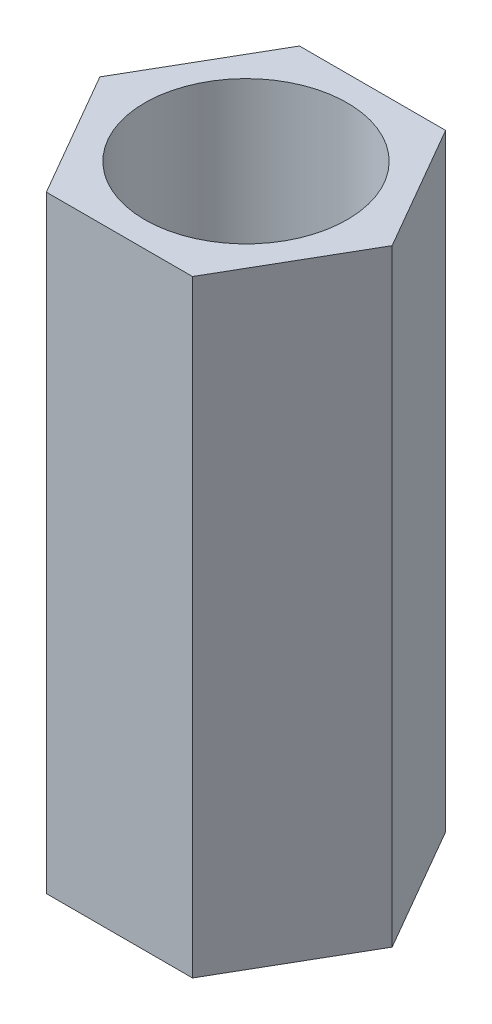
ISO-10303-21;
HEADER;
FILE_DESCRIPTION(('STEP AP214'),'2;1');
FILE_NAME('part.step','',(''),(''),'','','');
FILE_SCHEMA(('AUTOMOTIVE_DESIGN { 1 0 10303 214 1 1 1 1 }'));
ENDSEC;
DATA;
#1=APPLICATION_CONTEXT('core data for automotive mechanical design processes');
#2=APPLICATION_PROTOCOL_DEFINITION('international standard','automotive_design',2000,#1);
#3=PRODUCT_CONTEXT('',#1,'mechanical');
#4=PRODUCT('Part','Part','',(#3));
#5=PRODUCT_RELATED_PRODUCT_CATEGORY('part','',(#4));
#6=PRODUCT_DEFINITION_FORMATION('','',#4);
#7=PRODUCT_DEFINITION_CONTEXT('part definition',#1,'design');
#8=PRODUCT_DEFINITION('design','',#6,#7);
#9=PRODUCT_DEFINITION_SHAPE('','',#8);
#10=(LENGTH_UNIT() NAMED_UNIT(*) SI_UNIT(.MILLI.,.METRE.));
#11=(NAMED_UNIT(*) PLANE_ANGLE_UNIT() SI_UNIT($,.RADIAN.));
#12=(NAMED_UNIT(*) SI_UNIT($,.STERADIAN.) SOLID_ANGLE_UNIT());
#13=UNCERTAINTY_MEASURE_WITH_UNIT(LENGTH_MEASURE(1.E-05),#10,'distance_accuracy_value','');
#14=(GEOMETRIC_REPRESENTATION_CONTEXT(3) GLOBAL_UNCERTAINTY_ASSIGNED_CONTEXT((#13)) GLOBAL_UNIT_ASSIGNED_CONTEXT((#10,
#11,#12)) REPRESENTATION_CONTEXT('',''));
#15=CARTESIAN_POINT('',(0.,0.,0.));
#16=DIRECTION('',(0.,0.,1.));
#17=DIRECTION('',(1.,0.,0.));
#18=AXIS2_PLACEMENT_3D('',#15,#16,#17);
#19=CARTESIAN_POINT('',(0.,12.,0.));
#20=DIRECTION('',(0.,1.,0.));
#21=DIRECTION('',(0.,0.,1.));
#22=AXIS2_PLACEMENT_3D('',#19,#20,#21);
#23=PLANE('',#22);
#24=DIRECTION('',(-0.5,0.,-0.866025403784439));
#25=VECTOR('',#24,1.);
#26=CARTESIAN_POINT('',(2.88675134594813,12.,0.));
#27=LINE('',#26,#25);
#28=CARTESIAN_POINT('',(2.88675134594813,12.,0.));
#29=VERTEX_POINT('',#28);
#30=CARTESIAN_POINT('',(1.44337567297406,12.,-2.5));
#31=VERTEX_POINT('',#30);
#32=EDGE_CURVE('E130',#29,#31,#27,.T.);
#33=ORIENTED_EDGE('',*,*,#32,.T.);
#34=DIRECTION('',(-1.,0.,0.));
#35=VECTOR('',#34,1.);
#36=CARTESIAN_POINT('',(1.44337567297406,12.,-2.5));
#37=LINE('',#36,#35);
#38=CARTESIAN_POINT('',(-1.44337567297406,12.,-2.5));
#39=VERTEX_POINT('',#38);
#40=EDGE_CURVE('E88',#31,#39,#37,.T.);
#41=ORIENTED_EDGE('',*,*,#40,.T.);
#42=DIRECTION('',(-0.5,0.,0.866025403784439));
#43=VECTOR('',#42,1.);
#44=CARTESIAN_POINT('',(-1.44337567297406,12.,-2.5));
#45=LINE('',#44,#43);
#46=CARTESIAN_POINT('',(-2.88675134594813,12.,0.));
#47=VERTEX_POINT('',#46);
#48=EDGE_CURVE('E101',#39,#47,#45,.T.);
#49=ORIENTED_EDGE('',*,*,#48,.T.);
#50=DIRECTION('',(0.5,0.,0.866025403784439));
#51=VECTOR('',#50,1.);
#52=CARTESIAN_POINT('',(-2.88675134594813,12.,0.));
#53=LINE('',#52,#51);
#54=CARTESIAN_POINT('',(-1.44337567297406,12.,2.5));
#55=VERTEX_POINT('',#54);
#56=EDGE_CURVE('E95',#47,#55,#53,.T.);
#57=ORIENTED_EDGE('',*,*,#56,.T.);
#58=DIRECTION('',(1.,0.,0.));
#59=VECTOR('',#58,1.);
#60=CARTESIAN_POINT('',(-1.44337567297406,12.,2.5));
#61=LINE('',#60,#59);
#62=CARTESIAN_POINT('',(1.44337567297406,12.,2.5));
#63=VERTEX_POINT('',#62);
#64=EDGE_CURVE('E99',#55,#63,#61,.T.);
#65=ORIENTED_EDGE('',*,*,#64,.T.);
#66=DIRECTION('',(0.5,0.,-0.866025403784438));
#67=VECTOR('',#66,1.);
#68=CARTESIAN_POINT('',(1.44337567297406,12.,2.5));
#69=LINE('',#68,#67);
#70=EDGE_CURVE('E51',#63,#29,#69,.T.);
#71=ORIENTED_EDGE('',*,*,#70,.T.);
#72=EDGE_LOOP('',(#33,#41,#49,#57,#65,#71));
#73=FACE_BOUND('',#72,.T.);
#74=CARTESIAN_POINT('',(0.,12.,0.));
#75=DIRECTION('',(0.,1.,0.));
#76=DIRECTION('',(0.,0.,1.));
#77=AXIS2_PLACEMENT_3D('',#74,#75,#76);
#78=CIRCLE('',#77,2.);
#79=CARTESIAN_POINT('',(0.,12.,2.));
#80=VERTEX_POINT('',#79);
#81=EDGE_CURVE('E123',#80,#80,#78,.T.);
#82=ORIENTED_EDGE('',*,*,#81,.F.);
#83=EDGE_LOOP('',(#82));
#84=FACE_BOUND('',#83,.T.);
#85=ADVANCED_FACE('F34',(#73,#84),#23,.T.);
#86=CARTESIAN_POINT('',(0.,0.,0.));
#87=DIRECTION('',(0.,1.,0.));
#88=DIRECTION('',(0.,0.,1.));
#89=AXIS2_PLACEMENT_3D('',#86,#87,#88);
#90=PLANE('',#89);
#91=DIRECTION('',(-0.5,0.,-0.866025403784439));
#92=VECTOR('',#91,1.);
#93=CARTESIAN_POINT('',(2.88675134594813,0.,0.));
#94=LINE('',#93,#92);
#95=CARTESIAN_POINT('',(2.88675134594813,0.,0.));
#96=VERTEX_POINT('',#95);
#97=CARTESIAN_POINT('',(1.44337567297406,0.,-2.5));
#98=VERTEX_POINT('',#97);
#99=EDGE_CURVE('E119',#96,#98,#94,.T.);
#100=ORIENTED_EDGE('',*,*,#99,.F.);
#101=DIRECTION('',(0.5,0.,-0.866025403784438));
#102=VECTOR('',#101,1.);
#103=CARTESIAN_POINT('',(1.44337567297406,0.,2.5));
#104=LINE('',#103,#102);
#105=CARTESIAN_POINT('',(1.44337567297406,0.,2.5));
#106=VERTEX_POINT('',#105);
#107=EDGE_CURVE('E80',#106,#96,#104,.T.);
#108=ORIENTED_EDGE('',*,*,#107,.F.);
#109=DIRECTION('',(1.,0.,0.));
#110=VECTOR('',#109,1.);
#111=CARTESIAN_POINT('',(-1.44337567297406,0.,2.5));
#112=LINE('',#111,#110);
#113=CARTESIAN_POINT('',(-1.44337567297406,0.,2.5));
#114=VERTEX_POINT('',#113);
#115=EDGE_CURVE('E74',#114,#106,#112,.T.);
#116=ORIENTED_EDGE('',*,*,#115,.F.);
#117=DIRECTION('',(0.5,0.,0.866025403784439));
#118=VECTOR('',#117,1.);
#119=CARTESIAN_POINT('',(-2.88675134594813,0.,0.));
#120=LINE('',#119,#118);
#121=CARTESIAN_POINT('',(-2.88675134594813,0.,0.));
#122=VERTEX_POINT('',#121);
#123=EDGE_CURVE('E109',#122,#114,#120,.T.);
#124=ORIENTED_EDGE('',*,*,#123,.F.);
#125=DIRECTION('',(-0.5,0.,0.866025403784439));
#126=VECTOR('',#125,1.);
#127=CARTESIAN_POINT('',(-1.44337567297406,0.,-2.5));
#128=LINE('',#127,#126);
#129=CARTESIAN_POINT('',(-1.44337567297406,0.,-2.5));
#130=VERTEX_POINT('',#129);
#131=EDGE_CURVE('E125',#130,#122,#128,.T.);
#132=ORIENTED_EDGE('',*,*,#131,.F.);
#133=DIRECTION('',(-1.,0.,0.));
#134=VECTOR('',#133,1.);
#135=CARTESIAN_POINT('',(1.44337567297406,0.,-2.5));
#136=LINE('',#135,#134);
#137=EDGE_CURVE('E122',#98,#130,#136,.T.);
#138=ORIENTED_EDGE('',*,*,#137,.F.);
#139=EDGE_LOOP('',(#100,#108,#116,#124,#132,#138));
#140=FACE_BOUND('',#139,.T.);
#141=CARTESIAN_POINT('',(0.,0.,0.));
#142=DIRECTION('',(0.,1.,0.));
#143=DIRECTION('',(0.,0.,1.));
#144=AXIS2_PLACEMENT_3D('',#141,#142,#143);
#145=CIRCLE('',#144,2.);
#146=CARTESIAN_POINT('',(0.,0.,2.));
#147=VERTEX_POINT('',#146);
#148=EDGE_CURVE('E223',#147,#147,#145,.T.);
#149=ORIENTED_EDGE('',*,*,#148,.T.);
#150=EDGE_LOOP('',(#149));
#151=FACE_BOUND('',#150,.T.);
#152=ADVANCED_FACE('F139',(#140,#151),#90,.F.);
#153=CARTESIAN_POINT('',(2.88675134594813,12.,0.));
#154=DIRECTION('',(-0.866025403784438,0.,0.5));
#155=DIRECTION('',(0.5,0.,0.866025403784439));
#156=AXIS2_PLACEMENT_3D('',#153,#154,#155);
#157=PLANE('',#156);
#158=ORIENTED_EDGE('',*,*,#99,.T.);
#159=DIRECTION('',(0.,-1.,0.));
#160=VECTOR('',#159,1.);
#161=CARTESIAN_POINT('',(1.44337567297406,12.,-2.5));
#162=LINE('',#161,#160);
#163=EDGE_CURVE('E11',#31,#98,#162,.T.);
#164=ORIENTED_EDGE('',*,*,#163,.F.);
#165=ORIENTED_EDGE('',*,*,#32,.F.);
#166=DIRECTION('',(0.,-1.,0.));
#167=VECTOR('',#166,1.);
#168=CARTESIAN_POINT('',(2.88675134594813,12.,0.));
#169=LINE('',#168,#167);
#170=EDGE_CURVE('E115',#29,#96,#169,.T.);
#171=ORIENTED_EDGE('',*,*,#170,.T.);
#172=EDGE_LOOP('',(#158,#164,#165,#171));
#173=FACE_BOUND('',#172,.T.);
#174=ADVANCED_FACE('F36',(#173),#157,.F.);
#175=CARTESIAN_POINT('',(1.44337567297406,12.,-2.5));
#176=DIRECTION('',(0.,0.,1.));
#177=DIRECTION('',(1.,0.,0.));
#178=AXIS2_PLACEMENT_3D('',#175,#176,#177);
#179=PLANE('',#178);
#180=ORIENTED_EDGE('',*,*,#137,.T.);
#181=DIRECTION('',(0.,-1.,0.));
#182=VECTOR('',#181,1.);
#183=CARTESIAN_POINT('',(-1.44337567297406,12.,-2.5));
#184=LINE('',#183,#182);
#185=EDGE_CURVE('E43',#39,#130,#184,.T.);
#186=ORIENTED_EDGE('',*,*,#185,.F.);
#187=ORIENTED_EDGE('',*,*,#40,.F.);
#188=ORIENTED_EDGE('',*,*,#163,.T.);
#189=EDGE_LOOP('',(#180,#186,#187,#188));
#190=FACE_BOUND('',#189,.T.);
#191=ADVANCED_FACE('F164',(#190),#179,.F.);
#192=CARTESIAN_POINT('',(-1.44337567297406,12.,-2.5));
#193=DIRECTION('',(0.866025403784438,0.,0.5));
#194=DIRECTION('',(0.5,0.,-0.866025403784439));
#195=AXIS2_PLACEMENT_3D('',#192,#193,#194);
#196=PLANE('',#195);
#197=ORIENTED_EDGE('',*,*,#131,.T.);
#198=DIRECTION('',(0.,-1.,0.));
#199=VECTOR('',#198,1.);
#200=CARTESIAN_POINT('',(-2.88675134594813,12.,0.));
#201=LINE('',#200,#199);
#202=EDGE_CURVE('E110',#47,#122,#201,.T.);
#203=ORIENTED_EDGE('',*,*,#202,.F.);
#204=ORIENTED_EDGE('',*,*,#48,.F.);
#205=ORIENTED_EDGE('',*,*,#185,.T.);
#206=EDGE_LOOP('',(#197,#203,#204,#205));
#207=FACE_BOUND('',#206,.T.);
#208=ADVANCED_FACE('F136',(#207),#196,.F.);
#209=CARTESIAN_POINT('',(-2.88675134594813,12.,0.));
#210=DIRECTION('',(0.866025403784439,0.,-0.5));
#211=DIRECTION('',(-0.5,0.,-0.866025403784439));
#212=AXIS2_PLACEMENT_3D('',#209,#210,#211);
#213=PLANE('',#212);
#214=ORIENTED_EDGE('',*,*,#123,.T.);
#215=DIRECTION('',(0.,-1.,0.));
#216=VECTOR('',#215,1.);
#217=CARTESIAN_POINT('',(-1.44337567297406,12.,2.5));
#218=LINE('',#217,#216);
#219=EDGE_CURVE('E106',#55,#114,#218,.T.);
#220=ORIENTED_EDGE('',*,*,#219,.F.);
#221=ORIENTED_EDGE('',*,*,#56,.F.);
#222=ORIENTED_EDGE('',*,*,#202,.T.);
#223=EDGE_LOOP('',(#214,#220,#221,#222));
#224=FACE_BOUND('',#223,.T.);
#225=ADVANCED_FACE('F107',(#224),#213,.F.);
#226=CARTESIAN_POINT('',(-1.44337567297406,12.,2.5));
#227=DIRECTION('',(0.,0.,-1.));
#228=DIRECTION('',(-1.,0.,0.));
#229=AXIS2_PLACEMENT_3D('',#226,#227,#228);
#230=PLANE('',#229);
#231=ORIENTED_EDGE('',*,*,#115,.T.);
#232=DIRECTION('',(0.,-1.,0.));
#233=VECTOR('',#232,1.);
#234=CARTESIAN_POINT('',(1.44337567297406,12.,2.5));
#235=LINE('',#234,#233);
#236=EDGE_CURVE('E111',#63,#106,#235,.T.);
#237=ORIENTED_EDGE('',*,*,#236,.F.);
#238=ORIENTED_EDGE('',*,*,#64,.F.);
#239=ORIENTED_EDGE('',*,*,#219,.T.);
#240=EDGE_LOOP('',(#231,#237,#238,#239));
#241=FACE_BOUND('',#240,.T.);
#242=ADVANCED_FACE('F113',(#241),#230,.F.);
#243=CARTESIAN_POINT('',(1.44337567297406,12.,2.5));
#244=DIRECTION('',(-0.866025403784438,0.,-0.5));
#245=DIRECTION('',(-0.5,0.,0.866025403784439));
#246=AXIS2_PLACEMENT_3D('',#243,#244,#245);
#247=PLANE('',#246);
#248=ORIENTED_EDGE('',*,*,#107,.T.);
#249=ORIENTED_EDGE('',*,*,#170,.F.);
#250=ORIENTED_EDGE('',*,*,#70,.F.);
#251=ORIENTED_EDGE('',*,*,#236,.T.);
#252=EDGE_LOOP('',(#248,#249,#250,#251));
#253=FACE_BOUND('',#252,.T.);
#254=ADVANCED_FACE('F144',(#253),#247,.F.);
#255=CARTESIAN_POINT('',(0.,12.,0.));
#256=DIRECTION('',(0.,-1.,0.));
#257=DIRECTION('',(0.,0.,-1.));
#258=AXIS2_PLACEMENT_3D('',#255,#256,#257);
#259=CYLINDRICAL_SURFACE('',#258,2.);
#260=ORIENTED_EDGE('',*,*,#81,.T.);
#261=EDGE_LOOP('',(#260));
#262=FACE_BOUND('',#261,.T.);
#263=ORIENTED_EDGE('',*,*,#148,.F.);
#264=EDGE_LOOP('',(#263));
#265=FACE_BOUND('',#264,.T.);
#266=ADVANCED_FACE('F146',(#262,#265),#259,.F.);
#267=CLOSED_SHELL('',(#85,#152,#174,#191,#208,#225,#242,#254,#266));
#268=MANIFOLD_SOLID_BREP('B2',#267);
#269=ADVANCED_BREP_SHAPE_REPRESENTATION('',(#18,#268),#14);
#270=SHAPE_DEFINITION_REPRESENTATION(#9,#269);
ENDSEC;
END-ISO-10303-21;
